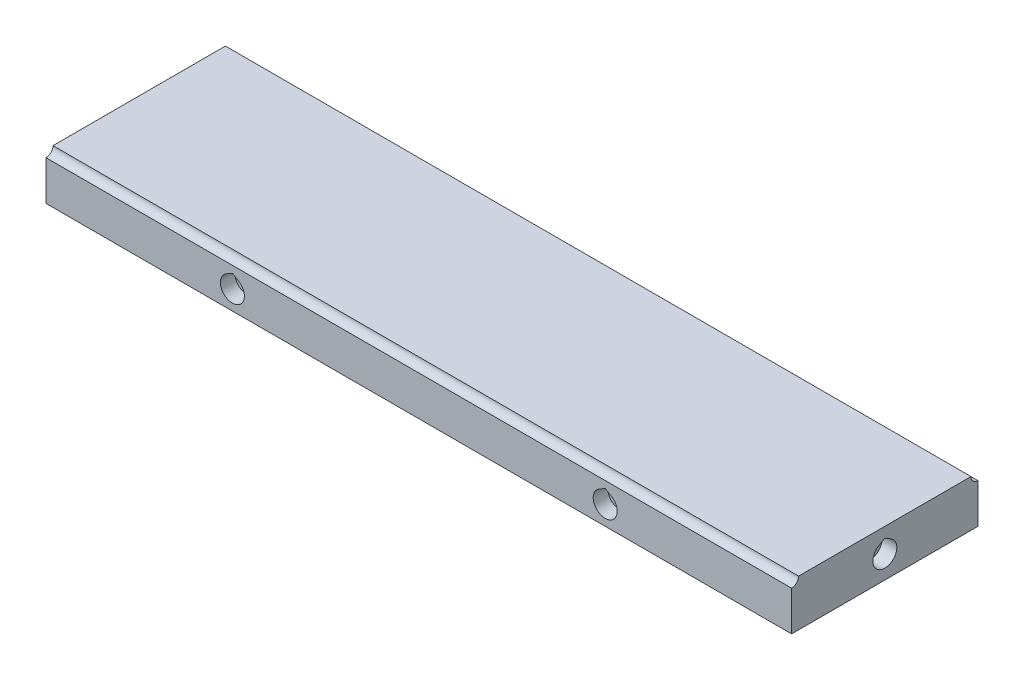
ISO-10303-21;
HEADER;
FILE_DESCRIPTION(('STEP AP214'),'2;1');
FILE_NAME('part.step','',(''),(''),'','','');
FILE_SCHEMA(('AUTOMOTIVE_DESIGN { 1 0 10303 214 1 1 1 1 }'));
ENDSEC;
DATA;
#1=APPLICATION_CONTEXT('core data for automotive mechanical design processes');
#2=APPLICATION_PROTOCOL_DEFINITION('international standard','automotive_design',2000,#1);
#3=PRODUCT_CONTEXT('',#1,'mechanical');
#4=PRODUCT('Part','Part','',(#3));
#5=PRODUCT_RELATED_PRODUCT_CATEGORY('part','',(#4));
#6=PRODUCT_DEFINITION_FORMATION('','',#4);
#7=PRODUCT_DEFINITION_CONTEXT('part definition',#1,'design');
#8=PRODUCT_DEFINITION('design','',#6,#7);
#9=PRODUCT_DEFINITION_SHAPE('','',#8);
#10=(LENGTH_UNIT() NAMED_UNIT(*) SI_UNIT(.MILLI.,.METRE.));
#11=(NAMED_UNIT(*) PLANE_ANGLE_UNIT() SI_UNIT($,.RADIAN.));
#12=(NAMED_UNIT(*) SI_UNIT($,.STERADIAN.) SOLID_ANGLE_UNIT());
#13=UNCERTAINTY_MEASURE_WITH_UNIT(LENGTH_MEASURE(1.E-05),#10,'distance_accuracy_value','');
#14=(GEOMETRIC_REPRESENTATION_CONTEXT(3) GLOBAL_UNCERTAINTY_ASSIGNED_CONTEXT((#13)) GLOBAL_UNIT_ASSIGNED_CONTEXT((#10,
#11,#12)) REPRESENTATION_CONTEXT('',''));
#15=CARTESIAN_POINT('',(0.,0.,0.));
#16=DIRECTION('',(0.,0.,1.));
#17=DIRECTION('',(1.,0.,0.));
#18=AXIS2_PLACEMENT_3D('',#15,#16,#17);
#19=CARTESIAN_POINT('',(-80.,-10.,20.));
#20=DIRECTION('',(-1.,0.,0.));
#21=DIRECTION('',(0.,0.,1.));
#22=AXIS2_PLACEMENT_3D('',#19,#20,#21);
#23=PLANE('',#22);
#24=DIRECTION('',(0.,0.,1.));
#25=VECTOR('',#24,1.);
#26=CARTESIAN_POINT('',(-80.,0.,20.));
#27=LINE('',#26,#25);
#28=CARTESIAN_POINT('',(-80.,0.,-18.5));
#29=VERTEX_POINT('',#28);
#30=CARTESIAN_POINT('',(-80.,0.,18.5));
#31=VERTEX_POINT('',#30);
#32=EDGE_CURVE('E351',#29,#31,#27,.T.);
#33=ORIENTED_EDGE('',*,*,#32,.F.);
#34=CARTESIAN_POINT('',(-80.,0.,-20.));
#35=DIRECTION('',(-1.,0.,0.));
#36=DIRECTION('',(0.,0.,1.));
#37=AXIS2_PLACEMENT_3D('',#34,#35,#36);
#38=CIRCLE('',#37,1.5);
#39=CARTESIAN_POINT('',(-80.,-1.5,-20.));
#40=VERTEX_POINT('',#39);
#41=EDGE_CURVE('E338',#29,#40,#38,.F.);
#42=ORIENTED_EDGE('',*,*,#41,.T.);
#43=DIRECTION('',(0.,1.,0.));
#44=VECTOR('',#43,1.);
#45=CARTESIAN_POINT('',(-80.,-10.,-20.));
#46=LINE('',#45,#44);
#47=CARTESIAN_POINT('',(-80.,-10.,-20.));
#48=VERTEX_POINT('',#47);
#49=EDGE_CURVE('E369',#48,#40,#46,.T.);
#50=ORIENTED_EDGE('',*,*,#49,.F.);
#51=DIRECTION('',(0.,0.,1.));
#52=VECTOR('',#51,1.);
#53=CARTESIAN_POINT('',(-80.,-10.,20.));
#54=LINE('',#53,#52);
#55=CARTESIAN_POINT('',(-80.,-10.,20.));
#56=VERTEX_POINT('',#55);
#57=EDGE_CURVE('E352',#48,#56,#54,.T.);
#58=ORIENTED_EDGE('',*,*,#57,.T.);
#59=DIRECTION('',(0.,1.,0.));
#60=VECTOR('',#59,1.);
#61=CARTESIAN_POINT('',(-80.,-10.,20.));
#62=LINE('',#61,#60);
#63=CARTESIAN_POINT('',(-80.,-1.5,20.));
#64=VERTEX_POINT('',#63);
#65=EDGE_CURVE('E365',#56,#64,#62,.T.);
#66=ORIENTED_EDGE('',*,*,#65,.T.);
#67=CARTESIAN_POINT('',(-80.,0.,20.));
#68=DIRECTION('',(-1.,0.,0.));
#69=DIRECTION('',(0.,0.,1.));
#70=AXIS2_PLACEMENT_3D('',#67,#68,#69);
#71=CIRCLE('',#70,1.5);
#72=EDGE_CURVE('E343',#64,#31,#71,.F.);
#73=ORIENTED_EDGE('',*,*,#72,.T.);
#74=EDGE_LOOP('',(#33,#42,#50,#58,#66,#73));
#75=FACE_BOUND('',#74,.T.);
#76=DIRECTION('',(0.,-0.499999999999998,0.86602540378444));
#77=VECTOR('',#76,1.);
#78=CARTESIAN_POINT('',(-80.,-1.66936729262754,-0.963809655774862));
#79=LINE('',#78,#77);
#80=CARTESIAN_POINT('',(-80.,-2.22582305683672,0.));
#81=VERTEX_POINT('',#80);
#82=CARTESIAN_POINT('',(-80.,-2.96916152841835,1.28749999999999));
#83=VERTEX_POINT('',#82);
#84=EDGE_CURVE('E218',#81,#83,#79,.T.);
#85=ORIENTED_EDGE('',*,*,#84,.T.);
#86=CARTESIAN_POINT('',(-80.,-5.19917694316328,0.));
#87=DIRECTION('',(-1.,0.,0.));
#88=DIRECTION('',(0.,0.,1.));
#89=AXIS2_PLACEMENT_3D('',#86,#87,#88);
#90=CIRCLE('',#89,2.575);
#91=CARTESIAN_POINT('',(-80.,-2.96916152841835,-1.28749999999999));
#92=VERTEX_POINT('',#91);
#93=EDGE_CURVE('E51',#83,#92,#90,.F.);
#94=ORIENTED_EDGE('',*,*,#93,.T.);
#95=DIRECTION('',(0.,-0.499999999999997,-0.86602540378444));
#96=VECTOR('',#95,1.);
#97=CARTESIAN_POINT('',(-80.,-1.66936729262754,0.963809655774862));
#98=LINE('',#97,#96);
#99=EDGE_CURVE('E215',#81,#92,#98,.T.);
#100=ORIENTED_EDGE('',*,*,#99,.F.);
#101=EDGE_LOOP('',(#85,#94,#100));
#102=FACE_BOUND('',#101,.T.);
#103=ADVANCED_FACE('F37',(#75,#102),#23,.T.);
#104=CARTESIAN_POINT('',(80.,-10.,20.));
#105=DIRECTION('',(1.,0.,0.));
#106=DIRECTION('',(0.,0.,-1.));
#107=AXIS2_PLACEMENT_3D('',#104,#105,#106);
#108=PLANE('',#107);
#109=DIRECTION('',(0.,1.,0.));
#110=VECTOR('',#109,1.);
#111=CARTESIAN_POINT('',(80.,-10.,-20.));
#112=LINE('',#111,#110);
#113=CARTESIAN_POINT('',(80.,-10.,-20.));
#114=VERTEX_POINT('',#113);
#115=CARTESIAN_POINT('',(80.,-1.5,-20.));
#116=VERTEX_POINT('',#115);
#117=EDGE_CURVE('E372',#114,#116,#112,.T.);
#118=ORIENTED_EDGE('',*,*,#117,.T.);
#119=CARTESIAN_POINT('',(80.,0.,-20.));
#120=DIRECTION('',(1.,0.,0.));
#121=DIRECTION('',(0.,0.,-1.));
#122=AXIS2_PLACEMENT_3D('',#119,#120,#121);
#123=CIRCLE('',#122,1.5);
#124=CARTESIAN_POINT('',(80.,0.,-18.5));
#125=VERTEX_POINT('',#124);
#126=EDGE_CURVE('E331',#116,#125,#123,.F.);
#127=ORIENTED_EDGE('',*,*,#126,.T.);
#128=DIRECTION('',(0.,0.,-1.));
#129=VECTOR('',#128,1.);
#130=CARTESIAN_POINT('',(80.,0.,20.));
#131=LINE('',#130,#129);
#132=CARTESIAN_POINT('',(80.,0.,18.5));
#133=VERTEX_POINT('',#132);
#134=EDGE_CURVE('E356',#133,#125,#131,.T.);
#135=ORIENTED_EDGE('',*,*,#134,.F.);
#136=CARTESIAN_POINT('',(80.,0.,20.));
#137=DIRECTION('',(1.,0.,0.));
#138=DIRECTION('',(0.,0.,-1.));
#139=AXIS2_PLACEMENT_3D('',#136,#137,#138);
#140=CIRCLE('',#139,1.5);
#141=CARTESIAN_POINT('',(80.,-1.5,20.));
#142=VERTEX_POINT('',#141);
#143=EDGE_CURVE('E346',#133,#142,#140,.F.);
#144=ORIENTED_EDGE('',*,*,#143,.T.);
#145=DIRECTION('',(0.,1.,0.));
#146=VECTOR('',#145,1.);
#147=CARTESIAN_POINT('',(80.,-10.,20.));
#148=LINE('',#147,#146);
#149=CARTESIAN_POINT('',(80.,-10.,20.));
#150=VERTEX_POINT('',#149);
#151=EDGE_CURVE('E375',#150,#142,#148,.T.);
#152=ORIENTED_EDGE('',*,*,#151,.F.);
#153=DIRECTION('',(0.,0.,-1.));
#154=VECTOR('',#153,1.);
#155=CARTESIAN_POINT('',(80.,-10.,20.));
#156=LINE('',#155,#154);
#157=EDGE_CURVE('E359',#150,#114,#156,.T.);
#158=ORIENTED_EDGE('',*,*,#157,.T.);
#159=EDGE_LOOP('',(#118,#127,#135,#144,#152,#158));
#160=FACE_BOUND('',#159,.T.);
#161=DIRECTION('',(0.,-0.499999999999998,-0.86602540378444));
#162=VECTOR('',#161,1.);
#163=CARTESIAN_POINT('',(80.,-1.66936729262754,0.963809655774862));
#164=LINE('',#163,#162);
#165=CARTESIAN_POINT('',(80.,-2.22582305683672,0.));
#166=VERTEX_POINT('',#165);
#167=CARTESIAN_POINT('',(80.,-2.96916152841835,-1.2875));
#168=VERTEX_POINT('',#167);
#169=EDGE_CURVE('E237',#166,#168,#164,.T.);
#170=ORIENTED_EDGE('',*,*,#169,.T.);
#171=CARTESIAN_POINT('',(80.,-5.19917694316328,0.));
#172=DIRECTION('',(1.,0.,0.));
#173=DIRECTION('',(0.,0.,-1.));
#174=AXIS2_PLACEMENT_3D('',#171,#172,#173);
#175=CIRCLE('',#174,2.575);
#176=CARTESIAN_POINT('',(80.,-2.96916152841835,1.28749999999999));
#177=VERTEX_POINT('',#176);
#178=EDGE_CURVE('E59',#168,#177,#175,.F.);
#179=ORIENTED_EDGE('',*,*,#178,.T.);
#180=DIRECTION('',(0.,-0.499999999999997,0.86602540378444));
#181=VECTOR('',#180,1.);
#182=CARTESIAN_POINT('',(80.,-1.66936729262754,-0.963809655774862));
#183=LINE('',#182,#181);
#184=EDGE_CURVE('E230',#166,#177,#183,.T.);
#185=ORIENTED_EDGE('',*,*,#184,.F.);
#186=EDGE_LOOP('',(#170,#179,#185));
#187=FACE_BOUND('',#186,.T.);
#188=ADVANCED_FACE('F387',(#160,#187),#108,.T.);
#189=CARTESIAN_POINT('',(-80.,-10.,-20.));
#190=DIRECTION('',(0.,0.,-1.));
#191=DIRECTION('',(-1.,0.,0.));
#192=AXIS2_PLACEMENT_3D('',#189,#190,#191);
#193=PLANE('',#192);
#194=CARTESIAN_POINT('',(-40.,-5.94917694316329,-20.));
#195=DIRECTION('',(0.,0.,-1.));
#196=DIRECTION('',(-1.,0.,0.));
#197=AXIS2_PLACEMENT_3D('',#194,#195,#196);
#198=CIRCLE('',#197,2.575);
#199=CARTESIAN_POINT('',(-38.7125,-3.71916152841836,-20.));
#200=VERTEX_POINT('',#199);
#201=CARTESIAN_POINT('',(-41.2875,-3.71916152841836,-20.));
#202=VERTEX_POINT('',#201);
#203=EDGE_CURVE('E267',#200,#202,#198,.T.);
#204=ORIENTED_EDGE('',*,*,#203,.F.);
#205=DIRECTION('',(-0.866025403784438,0.5,0.));
#206=VECTOR('',#205,1.);
#207=CARTESIAN_POINT('',(-71.288569182194,15.0886407830612,-20.));
#208=LINE('',#207,#206);
#209=CARTESIAN_POINT('',(-40.,-2.97582305683672,-20.));
#210=VERTEX_POINT('',#209);
#211=EDGE_CURVE('E296',#200,#210,#208,.T.);
#212=ORIENTED_EDGE('',*,*,#211,.T.);
#213=DIRECTION('',(-0.86602540378444,-0.499999999999997,0.));
#214=VECTOR('',#213,1.);
#215=CARTESIAN_POINT('',(-68.7114308178061,-19.5523753683163,-20.));
#216=LINE('',#215,#214);
#217=EDGE_CURVE('E302',#210,#202,#216,.T.);
#218=ORIENTED_EDGE('',*,*,#217,.T.);
#219=EDGE_LOOP('',(#204,#212,#218));
#220=FACE_BOUND('',#219,.T.);
#221=CARTESIAN_POINT('',(40.,-5.94917694316329,-20.));
#222=DIRECTION('',(0.,0.,-1.));
#223=DIRECTION('',(-1.,0.,0.));
#224=AXIS2_PLACEMENT_3D('',#221,#222,#223);
#225=CIRCLE('',#224,2.575);
#226=CARTESIAN_POINT('',(41.2875,-3.71916152841836,-20.));
#227=VERTEX_POINT('',#226);
#228=CARTESIAN_POINT('',(38.7125,-3.71916152841838,-20.));
#229=VERTEX_POINT('',#228);
#230=EDGE_CURVE('E309',#227,#229,#225,.T.);
#231=ORIENTED_EDGE('',*,*,#230,.F.);
#232=DIRECTION('',(-0.866025403784438,0.5,0.));
#233=VECTOR('',#232,1.);
#234=CARTESIAN_POINT('',(8.71143081780598,15.0886407830612,-20.));
#235=LINE('',#234,#233);
#236=CARTESIAN_POINT('',(40.,-2.97582305683672,-20.));
#237=VERTEX_POINT('',#236);
#238=EDGE_CURVE('E318',#227,#237,#235,.T.);
#239=ORIENTED_EDGE('',*,*,#238,.T.);
#240=DIRECTION('',(-0.86602540378444,-0.499999999999997,0.));
#241=VECTOR('',#240,1.);
#242=CARTESIAN_POINT('',(11.2885691821939,-19.5523753683163,-20.));
#243=LINE('',#242,#241);
#244=EDGE_CURVE('E324',#237,#229,#243,.T.);
#245=ORIENTED_EDGE('',*,*,#244,.T.);
#246=EDGE_LOOP('',(#231,#239,#245));
#247=FACE_BOUND('',#246,.T.);
#248=DIRECTION('',(-1.,0.,0.));
#249=VECTOR('',#248,1.);
#250=CARTESIAN_POINT('',(83.9999999999999,-1.5,-20.));
#251=LINE('',#250,#249);
#252=EDGE_CURVE('E341',#116,#40,#251,.T.);
#253=ORIENTED_EDGE('',*,*,#252,.F.);
#254=ORIENTED_EDGE('',*,*,#117,.F.);
#255=DIRECTION('',(-1.,0.,0.));
#256=VECTOR('',#255,1.);
#257=CARTESIAN_POINT('',(-80.,-10.,-20.));
#258=LINE('',#257,#256);
#259=EDGE_CURVE('E362',#114,#48,#258,.T.);
#260=ORIENTED_EDGE('',*,*,#259,.T.);
#261=ORIENTED_EDGE('',*,*,#49,.T.);
#262=EDGE_LOOP('',(#253,#254,#260,#261));
#263=FACE_BOUND('',#262,.T.);
#264=ADVANCED_FACE('F393',(#220,#247,#263),#193,.T.);
#265=CARTESIAN_POINT('',(-80.,-10.,20.));
#266=DIRECTION('',(0.,0.,1.));
#267=DIRECTION('',(1.,0.,0.));
#268=AXIS2_PLACEMENT_3D('',#265,#266,#267);
#269=PLANE('',#268);
#270=CARTESIAN_POINT('',(-40.,-5.94917694316329,20.));
#271=DIRECTION('',(0.,0.,1.));
#272=DIRECTION('',(1.,0.,0.));
#273=AXIS2_PLACEMENT_3D('',#270,#271,#272);
#274=CIRCLE('',#273,2.575);
#275=CARTESIAN_POINT('',(-41.2875,-3.71916152841836,20.));
#276=VERTEX_POINT('',#275);
#277=CARTESIAN_POINT('',(-38.7125,-3.71916152841835,20.));
#278=VERTEX_POINT('',#277);
#279=EDGE_CURVE('E257',#276,#278,#274,.T.);
#280=ORIENTED_EDGE('',*,*,#279,.F.);
#281=DIRECTION('',(0.866025403784438,0.5,0.));
#282=VECTOR('',#281,1.);
#283=CARTESIAN_POINT('',(-8.71143081780598,15.0886407830612,20.));
#284=LINE('',#283,#282);
#285=CARTESIAN_POINT('',(-40.,-2.97582305683672,20.));
#286=VERTEX_POINT('',#285);
#287=EDGE_CURVE('E252',#276,#286,#284,.T.);
#288=ORIENTED_EDGE('',*,*,#287,.T.);
#289=DIRECTION('',(0.86602540378444,-0.499999999999997,0.));
#290=VECTOR('',#289,1.);
#291=CARTESIAN_POINT('',(-11.2885691821939,-19.5523753683163,20.));
#292=LINE('',#291,#290);
#293=EDGE_CURVE('E259',#286,#278,#292,.T.);
#294=ORIENTED_EDGE('',*,*,#293,.T.);
#295=EDGE_LOOP('',(#280,#288,#294));
#296=FACE_BOUND('',#295,.T.);
#297=CARTESIAN_POINT('',(40.,-5.94917694316329,20.));
#298=DIRECTION('',(0.,0.,1.));
#299=DIRECTION('',(1.,0.,0.));
#300=AXIS2_PLACEMENT_3D('',#297,#298,#299);
#301=CIRCLE('',#300,2.575);
#302=CARTESIAN_POINT('',(38.7125,-3.71916152841836,20.));
#303=VERTEX_POINT('',#302);
#304=CARTESIAN_POINT('',(41.2875,-3.71916152841836,20.));
#305=VERTEX_POINT('',#304);
#306=EDGE_CURVE('E244',#303,#305,#301,.T.);
#307=ORIENTED_EDGE('',*,*,#306,.F.);
#308=DIRECTION('',(0.866025403784438,0.5,0.));
#309=VECTOR('',#308,1.);
#310=CARTESIAN_POINT('',(71.288569182194,15.0886407830612,20.));
#311=LINE('',#310,#309);
#312=CARTESIAN_POINT('',(40.,-2.97582305683672,20.));
#313=VERTEX_POINT('',#312);
#314=EDGE_CURVE('E276',#303,#313,#311,.T.);
#315=ORIENTED_EDGE('',*,*,#314,.T.);
#316=DIRECTION('',(0.86602540378444,-0.499999999999997,0.));
#317=VECTOR('',#316,1.);
#318=CARTESIAN_POINT('',(68.7114308178061,-19.5523753683163,20.));
#319=LINE('',#318,#317);
#320=EDGE_CURVE('E282',#313,#305,#319,.T.);
#321=ORIENTED_EDGE('',*,*,#320,.T.);
#322=EDGE_LOOP('',(#307,#315,#321));
#323=FACE_BOUND('',#322,.T.);
#324=DIRECTION('',(1.,0.,0.));
#325=VECTOR('',#324,1.);
#326=CARTESIAN_POINT('',(-81.,-1.5,20.));
#327=LINE('',#326,#325);
#328=EDGE_CURVE('E349',#64,#142,#327,.T.);
#329=ORIENTED_EDGE('',*,*,#328,.F.);
#330=ORIENTED_EDGE('',*,*,#65,.F.);
#331=DIRECTION('',(1.,0.,0.));
#332=VECTOR('',#331,1.);
#333=CARTESIAN_POINT('',(-80.,-10.,20.));
#334=LINE('',#333,#332);
#335=EDGE_CURVE('E355',#56,#150,#334,.T.);
#336=ORIENTED_EDGE('',*,*,#335,.T.);
#337=ORIENTED_EDGE('',*,*,#151,.T.);
#338=EDGE_LOOP('',(#329,#330,#336,#337));
#339=FACE_BOUND('',#338,.T.);
#340=ADVANCED_FACE('F404',(#296,#323,#339),#269,.T.);
#341=CARTESIAN_POINT('',(0.,-10.,0.));
#342=DIRECTION('',(0.,-1.,0.));
#343=DIRECTION('',(0.,0.,-1.));
#344=AXIS2_PLACEMENT_3D('',#341,#342,#343);
#345=PLANE('',#344);
#346=ORIENTED_EDGE('',*,*,#57,.F.);
#347=ORIENTED_EDGE('',*,*,#259,.F.);
#348=ORIENTED_EDGE('',*,*,#157,.F.);
#349=ORIENTED_EDGE('',*,*,#335,.F.);
#350=EDGE_LOOP('',(#346,#347,#348,#349));
#351=FACE_BOUND('',#350,.T.);
#352=ADVANCED_FACE('F400',(#351),#345,.T.);
#353=CARTESIAN_POINT('',(0.,0.,0.));
#354=DIRECTION('',(0.,-1.,0.));
#355=DIRECTION('',(0.,0.,-1.));
#356=AXIS2_PLACEMENT_3D('',#353,#354,#355);
#357=PLANE('',#356);
#358=ORIENTED_EDGE('',*,*,#134,.T.);
#359=DIRECTION('',(-1.,0.,0.));
#360=VECTOR('',#359,1.);
#361=CARTESIAN_POINT('',(83.9999999999999,0.,-18.5));
#362=LINE('',#361,#360);
#363=EDGE_CURVE('E11',#125,#29,#362,.T.);
#364=ORIENTED_EDGE('',*,*,#363,.T.);
#365=ORIENTED_EDGE('',*,*,#32,.T.);
#366=DIRECTION('',(1.,0.,0.));
#367=VECTOR('',#366,1.);
#368=CARTESIAN_POINT('',(-81.,0.,18.5));
#369=LINE('',#368,#367);
#370=EDGE_CURVE('E44',#31,#133,#369,.T.);
#371=ORIENTED_EDGE('',*,*,#370,.T.);
#372=EDGE_LOOP('',(#358,#364,#365,#371));
#373=FACE_BOUND('',#372,.T.);
#374=ADVANCED_FACE('F383',(#373),#357,.F.);
#375=CARTESIAN_POINT('',(-81.,0.,20.));
#376=DIRECTION('',(1.,0.,0.));
#377=DIRECTION('',(0.,0.,-1.));
#378=AXIS2_PLACEMENT_3D('',#375,#376,#377);
#379=CYLINDRICAL_SURFACE('',#378,1.5);
#380=ORIENTED_EDGE('',*,*,#328,.T.);
#381=ORIENTED_EDGE('',*,*,#143,.F.);
#382=ORIENTED_EDGE('',*,*,#370,.F.);
#383=ORIENTED_EDGE('',*,*,#72,.F.);
#384=EDGE_LOOP('',(#380,#381,#382,#383));
#385=FACE_BOUND('',#384,.T.);
#386=ADVANCED_FACE('F405',(#385),#379,.F.);
#387=CARTESIAN_POINT('',(83.9999999999999,0.,-20.));
#388=DIRECTION('',(-1.,0.,0.));
#389=DIRECTION('',(0.,0.,1.));
#390=AXIS2_PLACEMENT_3D('',#387,#388,#389);
#391=CYLINDRICAL_SURFACE('',#390,1.5);
#392=ORIENTED_EDGE('',*,*,#252,.T.);
#393=ORIENTED_EDGE('',*,*,#41,.F.);
#394=ORIENTED_EDGE('',*,*,#363,.F.);
#395=ORIENTED_EDGE('',*,*,#126,.F.);
#396=EDGE_LOOP('',(#392,#393,#394,#395));
#397=FACE_BOUND('',#396,.T.);
#398=ADVANCED_FACE('F391',(#397),#391,.F.);
#399=CARTESIAN_POINT('',(40.,-5.94917694316329,-16.85));
#400=DIRECTION('',(0.,0.,-1.));
#401=DIRECTION('',(-1.,0.,0.));
#402=AXIS2_PLACEMENT_3D('',#399,#400,#401);
#403=CYLINDRICAL_SURFACE('',#402,2.575);
#404=ORIENTED_EDGE('',*,*,#230,.T.);
#405=DIRECTION('',(0.,0.,-1.));
#406=VECTOR('',#405,1.);
#407=CARTESIAN_POINT('',(38.7125,-3.71916152841836,-16.85));
#408=LINE('',#407,#406);
#409=CARTESIAN_POINT('',(38.7125,-3.71916152841836,-16.85));
#410=VERTEX_POINT('',#409);
#411=EDGE_CURVE('E322',#410,#229,#408,.T.);
#412=ORIENTED_EDGE('',*,*,#411,.F.);
#413=CARTESIAN_POINT('',(40.,-5.94917694316329,-16.85));
#414=DIRECTION('',(0.,0.,-1.));
#415=DIRECTION('',(-1.,0.,0.));
#416=AXIS2_PLACEMENT_3D('',#413,#414,#415);
#417=CIRCLE('',#416,2.575);
#418=CARTESIAN_POINT('',(41.2875,-3.71916152841836,-16.85));
#419=VERTEX_POINT('',#418);
#420=EDGE_CURVE('E314',#419,#410,#417,.T.);
#421=ORIENTED_EDGE('',*,*,#420,.F.);
#422=DIRECTION('',(0.,0.,-1.));
#423=VECTOR('',#422,1.);
#424=CARTESIAN_POINT('',(41.2875,-3.71916152841836,-16.85));
#425=LINE('',#424,#423);
#426=EDGE_CURVE('E329',#419,#227,#425,.T.);
#427=ORIENTED_EDGE('',*,*,#426,.T.);
#428=EDGE_LOOP('',(#404,#412,#421,#427));
#429=FACE_BOUND('',#428,.T.);
#430=ADVANCED_FACE('F412',(#429),#403,.F.);
#431=CARTESIAN_POINT('',(8.71143081780598,15.0886407830612,-16.85));
#432=DIRECTION('',(-0.500000000000001,-0.866025403784438,0.));
#433=DIRECTION('',(0.866025403784438,-0.500000000000001,0.));
#434=AXIS2_PLACEMENT_3D('',#431,#432,#433);
#435=PLANE('',#434);
#436=ORIENTED_EDGE('',*,*,#238,.F.);
#437=ORIENTED_EDGE('',*,*,#426,.F.);
#438=DIRECTION('',(-0.866025403784438,0.5,0.));
#439=VECTOR('',#438,1.);
#440=CARTESIAN_POINT('',(8.71143081780598,15.0886407830612,-16.85));
#441=LINE('',#440,#439);
#442=CARTESIAN_POINT('',(40.,-2.97582305683672,-16.85));
#443=VERTEX_POINT('',#442);
#444=EDGE_CURVE('E320',#419,#443,#441,.T.);
#445=ORIENTED_EDGE('',*,*,#444,.T.);
#446=DIRECTION('',(0.,0.,-1.));
#447=VECTOR('',#446,1.);
#448=CARTESIAN_POINT('',(40.,-2.97582305683672,-16.85));
#449=LINE('',#448,#447);
#450=EDGE_CURVE('E332',#443,#237,#449,.T.);
#451=ORIENTED_EDGE('',*,*,#450,.T.);
#452=EDGE_LOOP('',(#436,#437,#445,#451));
#453=FACE_BOUND('',#452,.T.);
#454=ADVANCED_FACE('F481',(#453),#435,.T.);
#455=CARTESIAN_POINT('',(11.2885691821939,-19.5523753683163,-16.85));
#456=DIRECTION('',(0.499999999999997,-0.86602540378444,0.));
#457=DIRECTION('',(0.86602540378444,0.499999999999997,0.));
#458=AXIS2_PLACEMENT_3D('',#455,#456,#457);
#459=PLANE('',#458);
#460=ORIENTED_EDGE('',*,*,#244,.F.);
#461=ORIENTED_EDGE('',*,*,#450,.F.);
#462=DIRECTION('',(-0.86602540378444,-0.499999999999997,0.));
#463=VECTOR('',#462,1.);
#464=CARTESIAN_POINT('',(11.2885691821939,-19.5523753683163,-16.85));
#465=LINE('',#464,#463);
#466=EDGE_CURVE('E317',#443,#410,#465,.T.);
#467=ORIENTED_EDGE('',*,*,#466,.T.);
#468=ORIENTED_EDGE('',*,*,#411,.T.);
#469=EDGE_LOOP('',(#460,#461,#467,#468));
#470=FACE_BOUND('',#469,.T.);
#471=ADVANCED_FACE('F479',(#470),#459,.T.);
#472=CARTESIAN_POINT('',(0.,0.,-16.85));
#473=DIRECTION('',(0.,0.,-1.));
#474=DIRECTION('',(-1.,0.,0.));
#475=AXIS2_PLACEMENT_3D('',#472,#473,#474);
#476=PLANE('',#475);
#477=ORIENTED_EDGE('',*,*,#420,.T.);
#478=ORIENTED_EDGE('',*,*,#466,.F.);
#479=ORIENTED_EDGE('',*,*,#444,.F.);
#480=EDGE_LOOP('',(#477,#478,#479));
#481=FACE_BOUND('',#480,.T.);
#482=ADVANCED_FACE('F475',(#481),#476,.T.);
#483=CARTESIAN_POINT('',(-40.,-5.94917694316329,-16.85));
#484=DIRECTION('',(0.,0.,-1.));
#485=DIRECTION('',(-1.,0.,0.));
#486=AXIS2_PLACEMENT_3D('',#483,#484,#485);
#487=CYLINDRICAL_SURFACE('',#486,2.575);
#488=ORIENTED_EDGE('',*,*,#203,.T.);
#489=DIRECTION('',(0.,0.,-1.));
#490=VECTOR('',#489,1.);
#491=CARTESIAN_POINT('',(-41.2875,-3.71916152841836,-16.85));
#492=LINE('',#491,#490);
#493=CARTESIAN_POINT('',(-41.2875,-3.71916152841836,-16.85));
#494=VERTEX_POINT('',#493);
#495=EDGE_CURVE('E300',#494,#202,#492,.T.);
#496=ORIENTED_EDGE('',*,*,#495,.F.);
#497=CARTESIAN_POINT('',(-40.,-5.94917694316329,-16.85));
#498=DIRECTION('',(0.,0.,-1.));
#499=DIRECTION('',(-1.,0.,0.));
#500=AXIS2_PLACEMENT_3D('',#497,#498,#499);
#501=CIRCLE('',#500,2.575);
#502=CARTESIAN_POINT('',(-38.7125,-3.71916152841836,-16.85));
#503=VERTEX_POINT('',#502);
#504=EDGE_CURVE('E292',#503,#494,#501,.T.);
#505=ORIENTED_EDGE('',*,*,#504,.F.);
#506=DIRECTION('',(0.,0.,-1.));
#507=VECTOR('',#506,1.);
#508=CARTESIAN_POINT('',(-38.7125,-3.71916152841836,-16.85));
#509=LINE('',#508,#507);
#510=EDGE_CURVE('E307',#503,#200,#509,.T.);
#511=ORIENTED_EDGE('',*,*,#510,.T.);
#512=EDGE_LOOP('',(#488,#496,#505,#511));
#513=FACE_BOUND('',#512,.T.);
#514=ADVANCED_FACE('F468',(#513),#487,.F.);
#515=CARTESIAN_POINT('',(-71.288569182194,15.0886407830612,-16.85));
#516=DIRECTION('',(-0.500000000000001,-0.866025403784438,0.));
#517=DIRECTION('',(0.866025403784438,-0.500000000000001,0.));
#518=AXIS2_PLACEMENT_3D('',#515,#516,#517);
#519=PLANE('',#518);
#520=ORIENTED_EDGE('',*,*,#211,.F.);
#521=ORIENTED_EDGE('',*,*,#510,.F.);
#522=DIRECTION('',(-0.866025403784438,0.5,0.));
#523=VECTOR('',#522,1.);
#524=CARTESIAN_POINT('',(-71.288569182194,15.0886407830612,-16.85));
#525=LINE('',#524,#523);
#526=CARTESIAN_POINT('',(-40.,-2.97582305683672,-16.85));
#527=VERTEX_POINT('',#526);
#528=EDGE_CURVE('E298',#503,#527,#525,.T.);
#529=ORIENTED_EDGE('',*,*,#528,.T.);
#530=DIRECTION('',(0.,0.,-1.));
#531=VECTOR('',#530,1.);
#532=CARTESIAN_POINT('',(-40.,-2.97582305683672,-16.85));
#533=LINE('',#532,#531);
#534=EDGE_CURVE('E310',#527,#210,#533,.T.);
#535=ORIENTED_EDGE('',*,*,#534,.T.);
#536=EDGE_LOOP('',(#520,#521,#529,#535));
#537=FACE_BOUND('',#536,.T.);
#538=ADVANCED_FACE('F465',(#537),#519,.T.);
#539=CARTESIAN_POINT('',(-68.7114308178061,-19.5523753683163,-16.85));
#540=DIRECTION('',(0.499999999999997,-0.86602540378444,0.));
#541=DIRECTION('',(0.86602540378444,0.499999999999997,0.));
#542=AXIS2_PLACEMENT_3D('',#539,#540,#541);
#543=PLANE('',#542);
#544=ORIENTED_EDGE('',*,*,#217,.F.);
#545=ORIENTED_EDGE('',*,*,#534,.F.);
#546=DIRECTION('',(-0.86602540378444,-0.499999999999997,0.));
#547=VECTOR('',#546,1.);
#548=CARTESIAN_POINT('',(-68.7114308178061,-19.5523753683163,-16.85));
#549=LINE('',#548,#547);
#550=EDGE_CURVE('E295',#527,#494,#549,.T.);
#551=ORIENTED_EDGE('',*,*,#550,.T.);
#552=ORIENTED_EDGE('',*,*,#495,.T.);
#553=EDGE_LOOP('',(#544,#545,#551,#552));
#554=FACE_BOUND('',#553,.T.);
#555=ADVANCED_FACE('F463',(#554),#543,.T.);
#556=CARTESIAN_POINT('',(-80.,0.,-16.85));
#557=DIRECTION('',(0.,0.,-1.));
#558=DIRECTION('',(-1.,0.,0.));
#559=AXIS2_PLACEMENT_3D('',#556,#557,#558);
#560=PLANE('',#559);
#561=ORIENTED_EDGE('',*,*,#504,.T.);
#562=ORIENTED_EDGE('',*,*,#550,.F.);
#563=ORIENTED_EDGE('',*,*,#528,.F.);
#564=EDGE_LOOP('',(#561,#562,#563));
#565=FACE_BOUND('',#564,.T.);
#566=ADVANCED_FACE('F456',(#565),#560,.T.);
#567=CARTESIAN_POINT('',(40.,-5.94917694316329,16.85));
#568=DIRECTION('',(0.,0.,1.));
#569=DIRECTION('',(1.,0.,0.));
#570=AXIS2_PLACEMENT_3D('',#567,#568,#569);
#571=CYLINDRICAL_SURFACE('',#570,2.575);
#572=ORIENTED_EDGE('',*,*,#306,.T.);
#573=DIRECTION('',(0.,0.,1.));
#574=VECTOR('',#573,1.);
#575=CARTESIAN_POINT('',(41.2875,-3.71916152841836,16.85));
#576=LINE('',#575,#574);
#577=CARTESIAN_POINT('',(41.2875,-3.71916152841836,16.85));
#578=VERTEX_POINT('',#577);
#579=EDGE_CURVE('E280',#578,#305,#576,.T.);
#580=ORIENTED_EDGE('',*,*,#579,.F.);
#581=CARTESIAN_POINT('',(40.,-5.94917694316329,16.85));
#582=DIRECTION('',(0.,0.,1.));
#583=DIRECTION('',(1.,0.,0.));
#584=AXIS2_PLACEMENT_3D('',#581,#582,#583);
#585=CIRCLE('',#584,2.575);
#586=CARTESIAN_POINT('',(38.7125,-3.71916152841836,16.85));
#587=VERTEX_POINT('',#586);
#588=EDGE_CURVE('E272',#587,#578,#585,.T.);
#589=ORIENTED_EDGE('',*,*,#588,.F.);
#590=DIRECTION('',(0.,0.,1.));
#591=VECTOR('',#590,1.);
#592=CARTESIAN_POINT('',(38.7125,-3.71916152841836,16.85));
#593=LINE('',#592,#591);
#594=EDGE_CURVE('E260',#587,#303,#593,.T.);
#595=ORIENTED_EDGE('',*,*,#594,.T.);
#596=EDGE_LOOP('',(#572,#580,#589,#595));
#597=FACE_BOUND('',#596,.T.);
#598=ADVANCED_FACE('F438',(#597),#571,.F.);
#599=CARTESIAN_POINT('',(71.288569182194,15.0886407830612,16.85));
#600=DIRECTION('',(0.500000000000001,-0.866025403784438,0.));
#601=DIRECTION('',(0.866025403784438,0.500000000000001,0.));
#602=AXIS2_PLACEMENT_3D('',#599,#600,#601);
#603=PLANE('',#602);
#604=ORIENTED_EDGE('',*,*,#314,.F.);
#605=ORIENTED_EDGE('',*,*,#594,.F.);
#606=DIRECTION('',(0.866025403784438,0.5,0.));
#607=VECTOR('',#606,1.);
#608=CARTESIAN_POINT('',(71.288569182194,15.0886407830612,16.85));
#609=LINE('',#608,#607);
#610=CARTESIAN_POINT('',(40.,-2.97582305683672,16.85));
#611=VERTEX_POINT('',#610);
#612=EDGE_CURVE('E278',#587,#611,#609,.T.);
#613=ORIENTED_EDGE('',*,*,#612,.T.);
#614=DIRECTION('',(0.,0.,1.));
#615=VECTOR('',#614,1.);
#616=CARTESIAN_POINT('',(40.,-2.97582305683672,16.85));
#617=LINE('',#616,#615);
#618=EDGE_CURVE('E288',#611,#313,#617,.T.);
#619=ORIENTED_EDGE('',*,*,#618,.T.);
#620=EDGE_LOOP('',(#604,#605,#613,#619));
#621=FACE_BOUND('',#620,.T.);
#622=ADVANCED_FACE('F448',(#621),#603,.T.);
#623=CARTESIAN_POINT('',(68.7114308178061,-19.5523753683163,16.85));
#624=DIRECTION('',(-0.499999999999997,-0.86602540378444,0.));
#625=DIRECTION('',(0.86602540378444,-0.499999999999997,0.));
#626=AXIS2_PLACEMENT_3D('',#623,#624,#625);
#627=PLANE('',#626);
#628=ORIENTED_EDGE('',*,*,#320,.F.);
#629=ORIENTED_EDGE('',*,*,#618,.F.);
#630=DIRECTION('',(0.86602540378444,-0.499999999999997,0.));
#631=VECTOR('',#630,1.);
#632=CARTESIAN_POINT('',(68.7114308178061,-19.5523753683163,16.85));
#633=LINE('',#632,#631);
#634=EDGE_CURVE('E275',#611,#578,#633,.T.);
#635=ORIENTED_EDGE('',*,*,#634,.T.);
#636=ORIENTED_EDGE('',*,*,#579,.T.);
#637=EDGE_LOOP('',(#628,#629,#635,#636));
#638=FACE_BOUND('',#637,.T.);
#639=ADVANCED_FACE('F441',(#638),#627,.T.);
#640=CARTESIAN_POINT('',(80.,0.,16.85));
#641=DIRECTION('',(0.,0.,1.));
#642=DIRECTION('',(1.,0.,0.));
#643=AXIS2_PLACEMENT_3D('',#640,#641,#642);
#644=PLANE('',#643);
#645=ORIENTED_EDGE('',*,*,#588,.T.);
#646=ORIENTED_EDGE('',*,*,#634,.F.);
#647=ORIENTED_EDGE('',*,*,#612,.F.);
#648=EDGE_LOOP('',(#645,#646,#647));
#649=FACE_BOUND('',#648,.T.);
#650=ADVANCED_FACE('F446',(#649),#644,.T.);
#651=CARTESIAN_POINT('',(-40.,-5.94917694316329,16.85));
#652=DIRECTION('',(0.,0.,1.));
#653=DIRECTION('',(1.,0.,0.));
#654=AXIS2_PLACEMENT_3D('',#651,#652,#653);
#655=CYLINDRICAL_SURFACE('',#654,2.575);
#656=ORIENTED_EDGE('',*,*,#279,.T.);
#657=DIRECTION('',(0.,0.,1.));
#658=VECTOR('',#657,1.);
#659=CARTESIAN_POINT('',(-38.7125,-3.71916152841836,16.85));
#660=LINE('',#659,#658);
#661=CARTESIAN_POINT('',(-38.7125,-3.71916152841836,16.85));
#662=VERTEX_POINT('',#661);
#663=EDGE_CURVE('E256',#662,#278,#660,.T.);
#664=ORIENTED_EDGE('',*,*,#663,.F.);
#665=CARTESIAN_POINT('',(-40.,-5.94917694316329,16.85));
#666=DIRECTION('',(0.,0.,1.));
#667=DIRECTION('',(1.,0.,0.));
#668=AXIS2_PLACEMENT_3D('',#665,#666,#667);
#669=CIRCLE('',#668,2.575);
#670=CARTESIAN_POINT('',(-41.2875,-3.71916152841836,16.85));
#671=VERTEX_POINT('',#670);
#672=EDGE_CURVE('E248',#671,#662,#669,.T.);
#673=ORIENTED_EDGE('',*,*,#672,.F.);
#674=DIRECTION('',(0.,0.,1.));
#675=VECTOR('',#674,1.);
#676=CARTESIAN_POINT('',(-41.2875,-3.71916152841836,16.85));
#677=LINE('',#676,#675);
#678=EDGE_CURVE('E265',#671,#276,#677,.T.);
#679=ORIENTED_EDGE('',*,*,#678,.T.);
#680=EDGE_LOOP('',(#656,#664,#673,#679));
#681=FACE_BOUND('',#680,.T.);
#682=ADVANCED_FACE('F561',(#681),#655,.F.);
#683=CARTESIAN_POINT('',(-8.71143081780598,15.0886407830612,16.85));
#684=DIRECTION('',(0.500000000000001,-0.866025403784438,0.));
#685=DIRECTION('',(0.866025403784438,0.500000000000001,0.));
#686=AXIS2_PLACEMENT_3D('',#683,#684,#685);
#687=PLANE('',#686);
#688=ORIENTED_EDGE('',*,*,#287,.F.);
#689=ORIENTED_EDGE('',*,*,#678,.F.);
#690=DIRECTION('',(0.866025403784438,0.5,0.));
#691=VECTOR('',#690,1.);
#692=CARTESIAN_POINT('',(-8.71143081780598,15.0886407830612,16.85));
#693=LINE('',#692,#691);
#694=CARTESIAN_POINT('',(-40.,-2.97582305683672,16.85));
#695=VERTEX_POINT('',#694);
#696=EDGE_CURVE('E254',#671,#695,#693,.T.);
#697=ORIENTED_EDGE('',*,*,#696,.T.);
#698=DIRECTION('',(0.,0.,1.));
#699=VECTOR('',#698,1.);
#700=CARTESIAN_POINT('',(-40.,-2.97582305683672,16.85));
#701=LINE('',#700,#699);
#702=EDGE_CURVE('E268',#695,#286,#701,.T.);
#703=ORIENTED_EDGE('',*,*,#702,.T.);
#704=EDGE_LOOP('',(#688,#689,#697,#703));
#705=FACE_BOUND('',#704,.T.);
#706=ADVANCED_FACE('F569',(#705),#687,.T.);
#707=CARTESIAN_POINT('',(-11.2885691821939,-19.5523753683163,16.85));
#708=DIRECTION('',(-0.499999999999997,-0.86602540378444,0.));
#709=DIRECTION('',(0.86602540378444,-0.499999999999997,0.));
#710=AXIS2_PLACEMENT_3D('',#707,#708,#709);
#711=PLANE('',#710);
#712=ORIENTED_EDGE('',*,*,#293,.F.);
#713=ORIENTED_EDGE('',*,*,#702,.F.);
#714=DIRECTION('',(0.86602540378444,-0.499999999999997,0.));
#715=VECTOR('',#714,1.);
#716=CARTESIAN_POINT('',(-11.2885691821939,-19.5523753683163,16.85));
#717=LINE('',#716,#715);
#718=EDGE_CURVE('E251',#695,#662,#717,.T.);
#719=ORIENTED_EDGE('',*,*,#718,.T.);
#720=ORIENTED_EDGE('',*,*,#663,.T.);
#721=EDGE_LOOP('',(#712,#713,#719,#720));
#722=FACE_BOUND('',#721,.T.);
#723=ADVANCED_FACE('F579',(#722),#711,.T.);
#724=CARTESIAN_POINT('',(0.,0.,16.85));
#725=DIRECTION('',(0.,0.,1.));
#726=DIRECTION('',(1.,0.,0.));
#727=AXIS2_PLACEMENT_3D('',#724,#725,#726);
#728=PLANE('',#727);
#729=ORIENTED_EDGE('',*,*,#672,.T.);
#730=ORIENTED_EDGE('',*,*,#718,.F.);
#731=ORIENTED_EDGE('',*,*,#696,.F.);
#732=EDGE_LOOP('',(#729,#730,#731));
#733=FACE_BOUND('',#732,.T.);
#734=ADVANCED_FACE('F590',(#733),#728,.T.);
#735=CARTESIAN_POINT('',(76.85,-5.19917694316328,0.));
#736=DIRECTION('',(1.,0.,0.));
#737=DIRECTION('',(0.,0.,-1.));
#738=AXIS2_PLACEMENT_3D('',#735,#736,#737);
#739=CYLINDRICAL_SURFACE('',#738,2.575);
#740=ORIENTED_EDGE('',*,*,#178,.F.);
#741=DIRECTION('',(1.,0.,0.));
#742=VECTOR('',#741,1.);
#743=CARTESIAN_POINT('',(76.85,-2.96916152841835,-1.28749999999999));
#744=LINE('',#743,#742);
#745=CARTESIAN_POINT('',(76.85,-2.96916152841835,-1.28749999999999));
#746=VERTEX_POINT('',#745);
#747=EDGE_CURVE('E235',#746,#168,#744,.T.);
#748=ORIENTED_EDGE('',*,*,#747,.F.);
#749=CARTESIAN_POINT('',(76.85,-5.19917694316328,0.));
#750=DIRECTION('',(1.,0.,0.));
#751=DIRECTION('',(0.,0.,-1.));
#752=AXIS2_PLACEMENT_3D('',#749,#750,#751);
#753=CIRCLE('',#752,2.575);
#754=CARTESIAN_POINT('',(76.85,-2.96916152841835,1.28749999999999));
#755=VERTEX_POINT('',#754);
#756=EDGE_CURVE('E227',#746,#755,#753,.F.);
#757=ORIENTED_EDGE('',*,*,#756,.T.);
#758=DIRECTION('',(1.,0.,0.));
#759=VECTOR('',#758,1.);
#760=CARTESIAN_POINT('',(76.85,-2.96916152841835,1.28749999999999));
#761=LINE('',#760,#759);
#762=EDGE_CURVE('E242',#755,#177,#761,.T.);
#763=ORIENTED_EDGE('',*,*,#762,.T.);
#764=EDGE_LOOP('',(#740,#748,#757,#763));
#765=FACE_BOUND('',#764,.T.);
#766=ADVANCED_FACE('F601',(#765),#739,.F.);
#767=CARTESIAN_POINT('',(76.85,-1.66936729262754,-0.963809655774862));
#768=DIRECTION('',(0.,0.86602540378444,0.499999999999997));
#769=DIRECTION('',(0.,-0.499999999999997,0.86602540378444));
#770=AXIS2_PLACEMENT_3D('',#767,#768,#769);
#771=PLANE('',#770);
#772=ORIENTED_EDGE('',*,*,#184,.T.);
#773=ORIENTED_EDGE('',*,*,#762,.F.);
#774=DIRECTION('',(0.,-0.499999999999997,0.86602540378444));
#775=VECTOR('',#774,1.);
#776=CARTESIAN_POINT('',(76.85,-1.66936729262754,-0.963809655774862));
#777=LINE('',#776,#775);
#778=CARTESIAN_POINT('',(76.85,-2.22582305683672,0.));
#779=VERTEX_POINT('',#778);
#780=EDGE_CURVE('E232',#779,#755,#777,.T.);
#781=ORIENTED_EDGE('',*,*,#780,.F.);
#782=DIRECTION('',(1.,0.,0.));
#783=VECTOR('',#782,1.);
#784=CARTESIAN_POINT('',(76.85,-2.22582305683672,0.));
#785=LINE('',#784,#783);
#786=EDGE_CURVE('E245',#779,#166,#785,.T.);
#787=ORIENTED_EDGE('',*,*,#786,.T.);
#788=EDGE_LOOP('',(#772,#773,#781,#787));
#789=FACE_BOUND('',#788,.T.);
#790=ADVANCED_FACE('F618',(#789),#771,.F.);
#791=CARTESIAN_POINT('',(76.85,-1.66936729262754,0.963809655774862));
#792=DIRECTION('',(0.,-0.86602540378444,0.499999999999998));
#793=DIRECTION('',(0.,-0.499999999999998,-0.86602540378444));
#794=AXIS2_PLACEMENT_3D('',#791,#792,#793);
#795=PLANE('',#794);
#796=ORIENTED_EDGE('',*,*,#169,.F.);
#797=ORIENTED_EDGE('',*,*,#786,.F.);
#798=DIRECTION('',(0.,-0.499999999999998,-0.86602540378444));
#799=VECTOR('',#798,1.);
#800=CARTESIAN_POINT('',(76.85,-1.66936729262754,0.963809655774862));
#801=LINE('',#800,#799);
#802=EDGE_CURVE('E229',#779,#746,#801,.T.);
#803=ORIENTED_EDGE('',*,*,#802,.T.);
#804=ORIENTED_EDGE('',*,*,#747,.T.);
#805=EDGE_LOOP('',(#796,#797,#803,#804));
#806=FACE_BOUND('',#805,.T.);
#807=ADVANCED_FACE('F627',(#806),#795,.T.);
#808=CARTESIAN_POINT('',(76.85,0.,0.));
#809=DIRECTION('',(1.,0.,0.));
#810=DIRECTION('',(0.,0.,-1.));
#811=AXIS2_PLACEMENT_3D('',#808,#809,#810);
#812=PLANE('',#811);
#813=ORIENTED_EDGE('',*,*,#756,.F.);
#814=ORIENTED_EDGE('',*,*,#802,.F.);
#815=ORIENTED_EDGE('',*,*,#780,.T.);
#816=EDGE_LOOP('',(#813,#814,#815));
#817=FACE_BOUND('',#816,.T.);
#818=ADVANCED_FACE('F638',(#817),#812,.T.);
#819=CARTESIAN_POINT('',(-76.85,-5.19917694316328,0.));
#820=DIRECTION('',(-1.,0.,0.));
#821=DIRECTION('',(0.,0.,1.));
#822=AXIS2_PLACEMENT_3D('',#819,#820,#821);
#823=CYLINDRICAL_SURFACE('',#822,2.575);
#824=ORIENTED_EDGE('',*,*,#93,.F.);
#825=DIRECTION('',(-1.,0.,0.));
#826=VECTOR('',#825,1.);
#827=CARTESIAN_POINT('',(-76.85,-2.96916152841835,1.28749999999999));
#828=LINE('',#827,#826);
#829=CARTESIAN_POINT('',(-76.85,-2.96916152841835,1.28749999999999));
#830=VERTEX_POINT('',#829);
#831=EDGE_CURVE('E201',#830,#83,#828,.T.);
#832=ORIENTED_EDGE('',*,*,#831,.F.);
#833=CARTESIAN_POINT('',(-76.85,-5.19917694316328,0.));
#834=DIRECTION('',(-1.,0.,0.));
#835=DIRECTION('',(0.,0.,1.));
#836=AXIS2_PLACEMENT_3D('',#833,#834,#835);
#837=CIRCLE('',#836,2.575);
#838=CARTESIAN_POINT('',(-76.85,-2.96916152841835,-1.28749999999999));
#839=VERTEX_POINT('',#838);
#840=EDGE_CURVE('E209',#830,#839,#837,.F.);
#841=ORIENTED_EDGE('',*,*,#840,.T.);
#842=DIRECTION('',(-1.,0.,0.));
#843=VECTOR('',#842,1.);
#844=CARTESIAN_POINT('',(-76.85,-2.96916152841835,-1.28749999999999));
#845=LINE('',#844,#843);
#846=EDGE_CURVE('E224',#839,#92,#845,.T.);
#847=ORIENTED_EDGE('',*,*,#846,.T.);
#848=EDGE_LOOP('',(#824,#832,#841,#847));
#849=FACE_BOUND('',#848,.T.);
#850=ADVANCED_FACE('F211',(#849),#823,.F.);
#851=CARTESIAN_POINT('',(-76.85,-1.66936729262754,0.963809655774862));
#852=DIRECTION('',(0.,0.86602540378444,-0.499999999999997));
#853=DIRECTION('',(0.,0.499999999999997,0.86602540378444));
#854=AXIS2_PLACEMENT_3D('',#851,#852,#853);
#855=PLANE('',#854);
#856=ORIENTED_EDGE('',*,*,#99,.T.);
#857=ORIENTED_EDGE('',*,*,#846,.F.);
#858=DIRECTION('',(0.,-0.499999999999997,-0.86602540378444));
#859=VECTOR('',#858,1.);
#860=CARTESIAN_POINT('',(-76.85,-1.66936729262754,0.963809655774862));
#861=LINE('',#860,#859);
#862=CARTESIAN_POINT('',(-76.85,-2.22582305683672,0.));
#863=VERTEX_POINT('',#862);
#864=EDGE_CURVE('E208',#863,#839,#861,.T.);
#865=ORIENTED_EDGE('',*,*,#864,.F.);
#866=DIRECTION('',(-1.,0.,0.));
#867=VECTOR('',#866,1.);
#868=CARTESIAN_POINT('',(-76.85,-2.22582305683672,0.));
#869=LINE('',#868,#867);
#870=EDGE_CURVE('E203',#863,#81,#869,.T.);
#871=ORIENTED_EDGE('',*,*,#870,.T.);
#872=EDGE_LOOP('',(#856,#857,#865,#871));
#873=FACE_BOUND('',#872,.T.);
#874=ADVANCED_FACE('F666',(#873),#855,.F.);
#875=CARTESIAN_POINT('',(-76.85,-1.66936729262754,-0.963809655774862));
#876=DIRECTION('',(0.,-0.86602540378444,-0.499999999999998));
#877=DIRECTION('',(0.,0.499999999999998,-0.86602540378444));
#878=AXIS2_PLACEMENT_3D('',#875,#876,#877);
#879=PLANE('',#878);
#880=ORIENTED_EDGE('',*,*,#84,.F.);
#881=ORIENTED_EDGE('',*,*,#870,.F.);
#882=DIRECTION('',(0.,-0.499999999999998,0.86602540378444));
#883=VECTOR('',#882,1.);
#884=CARTESIAN_POINT('',(-76.85,-1.66936729262754,-0.963809655774862));
#885=LINE('',#884,#883);
#886=EDGE_CURVE('E198',#863,#830,#885,.T.);
#887=ORIENTED_EDGE('',*,*,#886,.T.);
#888=ORIENTED_EDGE('',*,*,#831,.T.);
#889=EDGE_LOOP('',(#880,#881,#887,#888));
#890=FACE_BOUND('',#889,.T.);
#891=ADVANCED_FACE('F200',(#890),#879,.T.);
#892=CARTESIAN_POINT('',(-76.85,0.,0.));
#893=DIRECTION('',(-1.,0.,0.));
#894=DIRECTION('',(0.,0.,1.));
#895=AXIS2_PLACEMENT_3D('',#892,#893,#894);
#896=PLANE('',#895);
#897=ORIENTED_EDGE('',*,*,#840,.F.);
#898=ORIENTED_EDGE('',*,*,#886,.F.);
#899=ORIENTED_EDGE('',*,*,#864,.T.);
#900=EDGE_LOOP('',(#897,#898,#899));
#901=FACE_BOUND('',#900,.T.);
#902=ADVANCED_FACE('F214',(#901),#896,.T.);
#903=CLOSED_SHELL('',(#103,#188,#264,#340,#352,#374,#386,#398,#430,#454,#471,#482,#514,#538,
#555,#566,#598,#622,#639,#650,#682,#706,#723,#734,#766,#790,#807,#818,#850,#874,#891,#902));
#904=MANIFOLD_SOLID_BREP('B2',#903);
#905=ADVANCED_BREP_SHAPE_REPRESENTATION('',(#18,#904),#14);
#906=SHAPE_DEFINITION_REPRESENTATION(#9,#905);
ENDSEC;
END-ISO-10303-21;
